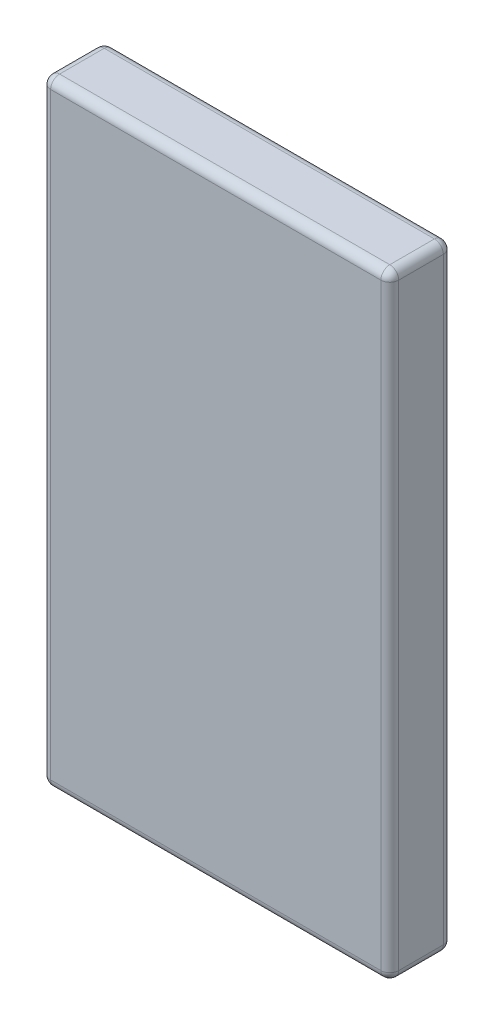
ISO-10303-21;
HEADER;
FILE_DESCRIPTION(('STEP AP214'),'2;1');
FILE_NAME('part.step','',(''),(''),'','','');
FILE_SCHEMA(('AUTOMOTIVE_DESIGN { 1 0 10303 214 1 1 1 1 }'));
ENDSEC;
DATA;
#1=APPLICATION_CONTEXT('core data for automotive mechanical design processes');
#2=APPLICATION_PROTOCOL_DEFINITION('international standard','automotive_design',2000,#1);
#3=PRODUCT_CONTEXT('',#1,'mechanical');
#4=PRODUCT('Part','Part','',(#3));
#5=PRODUCT_RELATED_PRODUCT_CATEGORY('part','',(#4));
#6=PRODUCT_DEFINITION_FORMATION('','',#4);
#7=PRODUCT_DEFINITION_CONTEXT('part definition',#1,'design');
#8=PRODUCT_DEFINITION('design','',#6,#7);
#9=PRODUCT_DEFINITION_SHAPE('','',#8);
#10=(LENGTH_UNIT() NAMED_UNIT(*) SI_UNIT(.MILLI.,.METRE.));
#11=(NAMED_UNIT(*) PLANE_ANGLE_UNIT() SI_UNIT($,.RADIAN.));
#12=(NAMED_UNIT(*) SI_UNIT($,.STERADIAN.) SOLID_ANGLE_UNIT());
#13=UNCERTAINTY_MEASURE_WITH_UNIT(LENGTH_MEASURE(1.E-05),#10,'distance_accuracy_value','');
#14=(GEOMETRIC_REPRESENTATION_CONTEXT(3) GLOBAL_UNCERTAINTY_ASSIGNED_CONTEXT((#13)) GLOBAL_UNIT_ASSIGNED_CONTEXT((#10,
#11,#12)) REPRESENTATION_CONTEXT('',''));
#15=CARTESIAN_POINT('',(0.,0.,0.));
#16=DIRECTION('',(0.,0.,1.));
#17=DIRECTION('',(1.,0.,0.));
#18=AXIS2_PLACEMENT_3D('',#15,#16,#17);
#19=CARTESIAN_POINT('',(-16.3760524459597,55.7720574898184,7.));
#20=DIRECTION('',(1.,0.,0.));
#21=DIRECTION('',(0.,1.,0.));
#22=AXIS2_PLACEMENT_3D('',#19,#20,#21);
#23=PLANE('',#22);
#24=DIRECTION('',(0.,0.,-1.));
#25=VECTOR('',#24,1.);
#26=CARTESIAN_POINT('',(-16.3760524459597,54.7720574898184,7.));
#27=LINE('',#26,#25);
#28=CARTESIAN_POINT('',(-16.3760524459597,54.7720574898184,6.));
#29=VERTEX_POINT('',#28);
#30=CARTESIAN_POINT('',(-16.3760524459597,54.7720574898184,1.));
#31=VERTEX_POINT('',#30);
#32=EDGE_CURVE('E136',#29,#31,#27,.T.);
#33=ORIENTED_EDGE('',*,*,#32,.T.);
#34=DIRECTION('',(0.,-1.,0.));
#35=VECTOR('',#34,1.);
#36=CARTESIAN_POINT('',(-16.3760524459597,55.7720574898184,1.));
#37=LINE('',#36,#35);
#38=CARTESIAN_POINT('',(-16.3760524459597,-12.2279425101816,1.));
#39=VERTEX_POINT('',#38);
#40=EDGE_CURVE('E132',#31,#39,#37,.T.);
#41=ORIENTED_EDGE('',*,*,#40,.T.);
#42=DIRECTION('',(0.,0.,-1.));
#43=VECTOR('',#42,1.);
#44=CARTESIAN_POINT('',(-16.3760524459597,-12.2279425101816,7.));
#45=LINE('',#44,#43);
#46=CARTESIAN_POINT('',(-16.3760524459597,-12.2279425101816,6.));
#47=VERTEX_POINT('',#46);
#48=EDGE_CURVE('E127',#39,#47,#45,.F.);
#49=ORIENTED_EDGE('',*,*,#48,.T.);
#50=DIRECTION('',(0.,-1.,0.));
#51=VECTOR('',#50,1.);
#52=CARTESIAN_POINT('',(-16.3760524459597,55.7720574898184,6.));
#53=LINE('',#52,#51);
#54=EDGE_CURVE('E129',#47,#29,#53,.F.);
#55=ORIENTED_EDGE('',*,*,#54,.T.);
#56=EDGE_LOOP('',(#33,#41,#49,#55));
#57=FACE_BOUND('',#56,.T.);
#58=ADVANCED_FACE('F35',(#57),#23,.F.);
#59=CARTESIAN_POINT('',(-16.3760524459597,-13.2279425101816,7.));
#60=DIRECTION('',(0.,1.,0.));
#61=DIRECTION('',(0.,0.,1.));
#62=AXIS2_PLACEMENT_3D('',#59,#60,#61);
#63=PLANE('',#62);
#64=DIRECTION('',(1.,0.,0.));
#65=VECTOR('',#64,1.);
#66=CARTESIAN_POINT('',(-16.3760524459597,-13.2279425101816,1.));
#67=LINE('',#66,#65);
#68=CARTESIAN_POINT('',(-15.3760524459597,-13.2279425101816,1.));
#69=VERTEX_POINT('',#68);
#70=CARTESIAN_POINT('',(21.6239475540403,-13.2279425101816,1.));
#71=VERTEX_POINT('',#70);
#72=EDGE_CURVE('E276',#69,#71,#67,.T.);
#73=ORIENTED_EDGE('',*,*,#72,.T.);
#74=DIRECTION('',(0.,0.,-1.));
#75=VECTOR('',#74,1.);
#76=CARTESIAN_POINT('',(21.6239475540403,-13.2279425101816,7.));
#77=LINE('',#76,#75);
#78=CARTESIAN_POINT('',(21.6239475540403,-13.2279425101816,6.));
#79=VERTEX_POINT('',#78);
#80=EDGE_CURVE('E279',#71,#79,#77,.F.);
#81=ORIENTED_EDGE('',*,*,#80,.T.);
#82=DIRECTION('',(1.,0.,0.));
#83=VECTOR('',#82,1.);
#84=CARTESIAN_POINT('',(-16.3760524459597,-13.2279425101816,6.));
#85=LINE('',#84,#83);
#86=CARTESIAN_POINT('',(-15.3760524459597,-13.2279425101816,6.));
#87=VERTEX_POINT('',#86);
#88=EDGE_CURVE('E270',#79,#87,#85,.F.);
#89=ORIENTED_EDGE('',*,*,#88,.T.);
#90=DIRECTION('',(0.,0.,-1.));
#91=VECTOR('',#90,1.);
#92=CARTESIAN_POINT('',(-15.3760524459597,-13.2279425101816,7.));
#93=LINE('',#92,#91);
#94=EDGE_CURVE('E158',#87,#69,#93,.T.);
#95=ORIENTED_EDGE('',*,*,#94,.T.);
#96=EDGE_LOOP('',(#73,#81,#89,#95));
#97=FACE_BOUND('',#96,.T.);
#98=ADVANCED_FACE('F325',(#97),#63,.F.);
#99=CARTESIAN_POINT('',(22.6239475540403,55.7720574898184,7.));
#100=DIRECTION('',(-1.,0.,0.));
#101=DIRECTION('',(0.,-1.,0.));
#102=AXIS2_PLACEMENT_3D('',#99,#100,#101);
#103=PLANE('',#102);
#104=DIRECTION('',(0.,1.,0.));
#105=VECTOR('',#104,1.);
#106=CARTESIAN_POINT('',(22.6239475540403,55.7720574898184,1.));
#107=LINE('',#106,#105);
#108=CARTESIAN_POINT('',(22.6239475540403,-12.2279425101816,1.));
#109=VERTEX_POINT('',#108);
#110=CARTESIAN_POINT('',(22.6239475540403,54.7720574898184,1.));
#111=VERTEX_POINT('',#110);
#112=EDGE_CURVE('E285',#109,#111,#107,.T.);
#113=ORIENTED_EDGE('',*,*,#112,.T.);
#114=DIRECTION('',(0.,0.,-1.));
#115=VECTOR('',#114,1.);
#116=CARTESIAN_POINT('',(22.6239475540403,54.7720574898184,7.));
#117=LINE('',#116,#115);
#118=CARTESIAN_POINT('',(22.6239475540403,54.7720574898184,6.));
#119=VERTEX_POINT('',#118);
#120=EDGE_CURVE('E213',#111,#119,#117,.F.);
#121=ORIENTED_EDGE('',*,*,#120,.T.);
#122=DIRECTION('',(0.,1.,0.));
#123=VECTOR('',#122,1.);
#124=CARTESIAN_POINT('',(22.6239475540403,-13.2279425101816,6.));
#125=LINE('',#124,#123);
#126=CARTESIAN_POINT('',(22.6239475540403,-12.2279425101816,6.));
#127=VERTEX_POINT('',#126);
#128=EDGE_CURVE('E283',#119,#127,#125,.F.);
#129=ORIENTED_EDGE('',*,*,#128,.T.);
#130=DIRECTION('',(0.,0.,-1.));
#131=VECTOR('',#130,1.);
#132=CARTESIAN_POINT('',(22.6239475540403,-12.2279425101816,7.));
#133=LINE('',#132,#131);
#134=EDGE_CURVE('E281',#127,#109,#133,.T.);
#135=ORIENTED_EDGE('',*,*,#134,.T.);
#136=EDGE_LOOP('',(#113,#121,#129,#135));
#137=FACE_BOUND('',#136,.T.);
#138=ADVANCED_FACE('F287',(#137),#103,.F.);
#139=CARTESIAN_POINT('',(-16.3760524459597,55.7720574898184,7.));
#140=DIRECTION('',(0.,-1.,0.));
#141=DIRECTION('',(0.,0.,-1.));
#142=AXIS2_PLACEMENT_3D('',#139,#140,#141);
#143=PLANE('',#142);
#144=DIRECTION('',(0.,0.,-1.));
#145=VECTOR('',#144,1.);
#146=CARTESIAN_POINT('',(21.6239475540403,55.7720574898184,7.));
#147=LINE('',#146,#145);
#148=CARTESIAN_POINT('',(21.6239475540403,55.7720574898184,6.));
#149=VERTEX_POINT('',#148);
#150=CARTESIAN_POINT('',(21.6239475540403,55.7720574898184,1.));
#151=VERTEX_POINT('',#150);
#152=EDGE_CURVE('E215',#149,#151,#147,.T.);
#153=ORIENTED_EDGE('',*,*,#152,.T.);
#154=DIRECTION('',(-1.,0.,0.));
#155=VECTOR('',#154,1.);
#156=CARTESIAN_POINT('',(-16.3760524459597,55.7720574898184,1.));
#157=LINE('',#156,#155);
#158=CARTESIAN_POINT('',(-15.3760524459597,55.7720574898184,1.));
#159=VERTEX_POINT('',#158);
#160=EDGE_CURVE('E222',#151,#159,#157,.T.);
#161=ORIENTED_EDGE('',*,*,#160,.T.);
#162=DIRECTION('',(0.,0.,-1.));
#163=VECTOR('',#162,1.);
#164=CARTESIAN_POINT('',(-15.3760524459597,55.7720574898184,7.));
#165=LINE('',#164,#163);
#166=CARTESIAN_POINT('',(-15.3760524459597,55.7720574898184,6.));
#167=VERTEX_POINT('',#166);
#168=EDGE_CURVE('E219',#159,#167,#165,.F.);
#169=ORIENTED_EDGE('',*,*,#168,.T.);
#170=DIRECTION('',(-1.,0.,0.));
#171=VECTOR('',#170,1.);
#172=CARTESIAN_POINT('',(22.6239475540403,55.7720574898184,6.));
#173=LINE('',#172,#171);
#174=EDGE_CURVE('E220',#167,#149,#173,.F.);
#175=ORIENTED_EDGE('',*,*,#174,.T.);
#176=EDGE_LOOP('',(#153,#161,#169,#175));
#177=FACE_BOUND('',#176,.T.);
#178=ADVANCED_FACE('F302',(#177),#143,.F.);
#179=CARTESIAN_POINT('',(0.,0.,7.));
#180=DIRECTION('',(0.,0.,1.));
#181=DIRECTION('',(1.,0.,0.));
#182=AXIS2_PLACEMENT_3D('',#179,#180,#181);
#183=PLANE('',#182);
#184=DIRECTION('',(0.,-1.,0.));
#185=VECTOR('',#184,1.);
#186=CARTESIAN_POINT('',(-15.3760524459597,-13.2279425101816,7.));
#187=LINE('',#186,#185);
#188=CARTESIAN_POINT('',(-15.3760524459597,54.7720574898184,7.));
#189=VERTEX_POINT('',#188);
#190=CARTESIAN_POINT('',(-15.3760524459597,-12.2279425101816,7.));
#191=VERTEX_POINT('',#190);
#192=EDGE_CURVE('E228',#189,#191,#187,.T.);
#193=ORIENTED_EDGE('',*,*,#192,.T.);
#194=DIRECTION('',(1.,0.,0.));
#195=VECTOR('',#194,1.);
#196=CARTESIAN_POINT('',(22.6239475540403,-12.2279425101816,7.));
#197=LINE('',#196,#195);
#198=CARTESIAN_POINT('',(21.6239475540403,-12.2279425101816,7.));
#199=VERTEX_POINT('',#198);
#200=EDGE_CURVE('E11',#191,#199,#197,.T.);
#201=ORIENTED_EDGE('',*,*,#200,.T.);
#202=DIRECTION('',(0.,1.,0.));
#203=VECTOR('',#202,1.);
#204=CARTESIAN_POINT('',(21.6239475540403,55.7720574898184,7.));
#205=LINE('',#204,#203);
#206=CARTESIAN_POINT('',(21.6239475540403,54.7720574898184,7.));
#207=VERTEX_POINT('',#206);
#208=EDGE_CURVE('E44',#199,#207,#205,.T.);
#209=ORIENTED_EDGE('',*,*,#208,.T.);
#210=DIRECTION('',(-1.,0.,0.));
#211=VECTOR('',#210,1.);
#212=CARTESIAN_POINT('',(-16.3760524459597,54.7720574898184,7.));
#213=LINE('',#212,#211);
#214=EDGE_CURVE('E230',#207,#189,#213,.T.);
#215=ORIENTED_EDGE('',*,*,#214,.T.);
#216=EDGE_LOOP('',(#193,#201,#209,#215));
#217=FACE_BOUND('',#216,.T.);
#218=ADVANCED_FACE('F350',(#217),#183,.T.);
#219=CARTESIAN_POINT('',(0.,0.,0.));
#220=DIRECTION('',(0.,0.,1.));
#221=DIRECTION('',(1.,0.,0.));
#222=AXIS2_PLACEMENT_3D('',#219,#220,#221);
#223=PLANE('',#222);
#224=DIRECTION('',(1.,0.,0.));
#225=VECTOR('',#224,1.);
#226=CARTESIAN_POINT('',(0.,-12.2279425101816,0.));
#227=LINE('',#226,#225);
#228=CARTESIAN_POINT('',(21.6239475540403,-12.2279425101816,0.));
#229=VERTEX_POINT('',#228);
#230=CARTESIAN_POINT('',(-15.3760524459597,-12.2279425101816,0.));
#231=VERTEX_POINT('',#230);
#232=EDGE_CURVE('E265',#229,#231,#227,.F.);
#233=ORIENTED_EDGE('',*,*,#232,.T.);
#234=DIRECTION('',(0.,-1.,0.));
#235=VECTOR('',#234,1.);
#236=CARTESIAN_POINT('',(-15.3760524459597,0.,0.));
#237=LINE('',#236,#235);
#238=CARTESIAN_POINT('',(-15.3760524459597,54.7720574898184,0.));
#239=VERTEX_POINT('',#238);
#240=EDGE_CURVE('E262',#231,#239,#237,.F.);
#241=ORIENTED_EDGE('',*,*,#240,.T.);
#242=DIRECTION('',(-1.,0.,0.));
#243=VECTOR('',#242,1.);
#244=CARTESIAN_POINT('',(0.,54.7720574898184,0.));
#245=LINE('',#244,#243);
#246=CARTESIAN_POINT('',(21.6239475540403,54.7720574898184,0.));
#247=VERTEX_POINT('',#246);
#248=EDGE_CURVE('E254',#239,#247,#245,.F.);
#249=ORIENTED_EDGE('',*,*,#248,.T.);
#250=DIRECTION('',(0.,1.,0.));
#251=VECTOR('',#250,1.);
#252=CARTESIAN_POINT('',(21.6239475540403,0.,0.));
#253=LINE('',#252,#251);
#254=EDGE_CURVE('E259',#247,#229,#253,.F.);
#255=ORIENTED_EDGE('',*,*,#254,.T.);
#256=EDGE_LOOP('',(#233,#241,#249,#255));
#257=FACE_BOUND('',#256,.T.);
#258=ADVANCED_FACE('F263',(#257),#223,.F.);
#259=CARTESIAN_POINT('',(21.6239475540403,0.,6.));
#260=DIRECTION('',(0.,-1.,0.));
#261=DIRECTION('',(1.,0.,0.));
#262=AXIS2_PLACEMENT_3D('',#259,#260,#261);
#263=CYLINDRICAL_SURFACE('',#262,1.);
#264=CARTESIAN_POINT('',(21.6239475540403,54.7720574898184,6.));
#265=DIRECTION('',(0.,1.,0.));
#266=DIRECTION('',(0.,0.,1.));
#267=AXIS2_PLACEMENT_3D('',#264,#265,#266);
#268=CIRCLE('',#267,1.);
#269=EDGE_CURVE('E39',#207,#119,#268,.T.);
#270=ORIENTED_EDGE('',*,*,#269,.F.);
#271=ORIENTED_EDGE('',*,*,#208,.F.);
#272=CARTESIAN_POINT('',(21.6239475540403,-12.2279425101816,6.));
#273=DIRECTION('',(0.,-1.,0.));
#274=DIRECTION('',(0.,0.,-1.));
#275=AXIS2_PLACEMENT_3D('',#272,#273,#274);
#276=CIRCLE('',#275,1.);
#277=EDGE_CURVE('E196',#127,#199,#276,.T.);
#278=ORIENTED_EDGE('',*,*,#277,.F.);
#279=ORIENTED_EDGE('',*,*,#128,.F.);
#280=EDGE_LOOP('',(#270,#271,#278,#279));
#281=FACE_BOUND('',#280,.T.);
#282=ADVANCED_FACE('F37',(#281),#263,.T.);
#283=CARTESIAN_POINT('',(21.6239475540403,54.7720574898184,6.));
#284=DIRECTION('',(0.,0.,1.));
#285=DIRECTION('',(1.,0.,0.));
#286=AXIS2_PLACEMENT_3D('',#283,#284,#285);
#287=SPHERICAL_SURFACE('',#286,1.);
#288=CARTESIAN_POINT('',(21.6239475540403,54.7720574898184,6.));
#289=DIRECTION('',(1.,0.,0.));
#290=DIRECTION('',(0.,0.,-1.));
#291=AXIS2_PLACEMENT_3D('',#288,#289,#290);
#292=CIRCLE('',#291,1.);
#293=EDGE_CURVE('E191',#207,#149,#292,.F.);
#294=ORIENTED_EDGE('',*,*,#293,.F.);
#295=ORIENTED_EDGE('',*,*,#269,.T.);
#296=CARTESIAN_POINT('',(21.6239475540403,54.7720574898184,6.));
#297=DIRECTION('',(0.,0.,1.));
#298=DIRECTION('',(1.,0.,0.));
#299=AXIS2_PLACEMENT_3D('',#296,#297,#298);
#300=CIRCLE('',#299,1.);
#301=EDGE_CURVE('E194',#149,#119,#300,.F.);
#302=ORIENTED_EDGE('',*,*,#301,.F.);
#303=EDGE_LOOP('',(#294,#295,#302));
#304=FACE_BOUND('',#303,.T.);
#305=ADVANCED_FACE('F204',(#304),#287,.T.);
#306=CARTESIAN_POINT('',(21.6239475540403,-12.2279425101816,6.));
#307=DIRECTION('',(0.,0.,1.));
#308=DIRECTION('',(1.,0.,0.));
#309=AXIS2_PLACEMENT_3D('',#306,#307,#308);
#310=SPHERICAL_SURFACE('',#309,1.);
#311=CARTESIAN_POINT('',(21.6239475540403,-12.2279425101816,6.));
#312=DIRECTION('',(0.,0.,1.));
#313=DIRECTION('',(1.,0.,0.));
#314=AXIS2_PLACEMENT_3D('',#311,#312,#313);
#315=CIRCLE('',#314,1.);
#316=EDGE_CURVE('E187',#127,#79,#315,.F.);
#317=ORIENTED_EDGE('',*,*,#316,.F.);
#318=ORIENTED_EDGE('',*,*,#277,.T.);
#319=CARTESIAN_POINT('',(21.6239475540403,-12.2279425101816,6.));
#320=DIRECTION('',(1.,0.,0.));
#321=DIRECTION('',(0.,0.,-1.));
#322=AXIS2_PLACEMENT_3D('',#319,#320,#321);
#323=CIRCLE('',#322,1.);
#324=EDGE_CURVE('E52',#79,#199,#323,.F.);
#325=ORIENTED_EDGE('',*,*,#324,.F.);
#326=EDGE_LOOP('',(#317,#318,#325));
#327=FACE_BOUND('',#326,.T.);
#328=ADVANCED_FACE('F290',(#327),#310,.T.);
#329=CARTESIAN_POINT('',(21.6239475540403,54.7720574898184,7.));
#330=DIRECTION('',(0.,0.,-1.));
#331=DIRECTION('',(-1.,0.,0.));
#332=AXIS2_PLACEMENT_3D('',#329,#330,#331);
#333=CYLINDRICAL_SURFACE('',#332,1.);
#334=ORIENTED_EDGE('',*,*,#301,.T.);
#335=ORIENTED_EDGE('',*,*,#120,.F.);
#336=CARTESIAN_POINT('',(21.6239475540403,54.7720574898184,1.));
#337=DIRECTION('',(0.,0.,-1.));
#338=DIRECTION('',(-1.,0.,0.));
#339=AXIS2_PLACEMENT_3D('',#336,#337,#338);
#340=CIRCLE('',#339,1.);
#341=EDGE_CURVE('E182',#151,#111,#340,.T.);
#342=ORIENTED_EDGE('',*,*,#341,.F.);
#343=ORIENTED_EDGE('',*,*,#152,.F.);
#344=EDGE_LOOP('',(#334,#335,#342,#343));
#345=FACE_BOUND('',#344,.T.);
#346=ADVANCED_FACE('F211',(#345),#333,.T.);
#347=CARTESIAN_POINT('',(0.,54.7720574898184,6.));
#348=DIRECTION('',(1.,0.,0.));
#349=DIRECTION('',(0.,0.,-1.));
#350=AXIS2_PLACEMENT_3D('',#347,#348,#349);
#351=CYLINDRICAL_SURFACE('',#350,1.);
#352=ORIENTED_EDGE('',*,*,#293,.T.);
#353=ORIENTED_EDGE('',*,*,#174,.F.);
#354=CARTESIAN_POINT('',(-15.3760524459597,54.7720574898184,6.));
#355=DIRECTION('',(-1.,0.,0.));
#356=DIRECTION('',(0.,0.,1.));
#357=AXIS2_PLACEMENT_3D('',#354,#355,#356);
#358=CIRCLE('',#357,1.);
#359=EDGE_CURVE('E179',#189,#167,#358,.T.);
#360=ORIENTED_EDGE('',*,*,#359,.F.);
#361=ORIENTED_EDGE('',*,*,#214,.F.);
#362=EDGE_LOOP('',(#352,#353,#360,#361));
#363=FACE_BOUND('',#362,.T.);
#364=ADVANCED_FACE('F307',(#363),#351,.T.);
#365=CARTESIAN_POINT('',(-15.3760524459597,0.,6.));
#366=DIRECTION('',(0.,1.,0.));
#367=DIRECTION('',(-1.,0.,0.));
#368=AXIS2_PLACEMENT_3D('',#365,#366,#367);
#369=CYLINDRICAL_SURFACE('',#368,1.);
#370=CARTESIAN_POINT('',(-15.3760524459597,-12.2279425101816,6.));
#371=DIRECTION('',(0.,-1.,0.));
#372=DIRECTION('',(0.,0.,-1.));
#373=AXIS2_PLACEMENT_3D('',#370,#371,#372);
#374=CIRCLE('',#373,1.);
#375=EDGE_CURVE('E143',#191,#47,#374,.T.);
#376=ORIENTED_EDGE('',*,*,#375,.F.);
#377=ORIENTED_EDGE('',*,*,#192,.F.);
#378=CARTESIAN_POINT('',(-15.3760524459597,54.7720574898184,6.));
#379=DIRECTION('',(0.,1.,0.));
#380=DIRECTION('',(0.,0.,1.));
#381=AXIS2_PLACEMENT_3D('',#378,#379,#380);
#382=CIRCLE('',#381,1.);
#383=EDGE_CURVE('E146',#29,#189,#382,.T.);
#384=ORIENTED_EDGE('',*,*,#383,.F.);
#385=ORIENTED_EDGE('',*,*,#54,.F.);
#386=EDGE_LOOP('',(#376,#377,#384,#385));
#387=FACE_BOUND('',#386,.T.);
#388=ADVANCED_FACE('F141',(#387),#369,.T.);
#389=CARTESIAN_POINT('',(0.,-12.2279425101816,6.));
#390=DIRECTION('',(-1.,0.,0.));
#391=DIRECTION('',(0.,0.,1.));
#392=AXIS2_PLACEMENT_3D('',#389,#390,#391);
#393=CYLINDRICAL_SURFACE('',#392,1.);
#394=ORIENTED_EDGE('',*,*,#324,.T.);
#395=ORIENTED_EDGE('',*,*,#200,.F.);
#396=CARTESIAN_POINT('',(-15.3760524459597,-12.2279425101816,6.));
#397=DIRECTION('',(-1.,0.,0.));
#398=DIRECTION('',(0.,0.,1.));
#399=AXIS2_PLACEMENT_3D('',#396,#397,#398);
#400=CIRCLE('',#399,1.);
#401=EDGE_CURVE('E155',#87,#191,#400,.T.);
#402=ORIENTED_EDGE('',*,*,#401,.F.);
#403=ORIENTED_EDGE('',*,*,#88,.F.);
#404=EDGE_LOOP('',(#394,#395,#402,#403));
#405=FACE_BOUND('',#404,.T.);
#406=ADVANCED_FACE('F349',(#405),#393,.T.);
#407=CARTESIAN_POINT('',(21.6239475540403,-12.2279425101816,7.));
#408=DIRECTION('',(0.,0.,-1.));
#409=DIRECTION('',(-1.,0.,0.));
#410=AXIS2_PLACEMENT_3D('',#407,#408,#409);
#411=CYLINDRICAL_SURFACE('',#410,1.);
#412=ORIENTED_EDGE('',*,*,#316,.T.);
#413=ORIENTED_EDGE('',*,*,#80,.F.);
#414=CARTESIAN_POINT('',(21.6239475540403,-12.2279425101816,1.));
#415=DIRECTION('',(0.,0.,-1.));
#416=DIRECTION('',(-1.,0.,0.));
#417=AXIS2_PLACEMENT_3D('',#414,#415,#416);
#418=CIRCLE('',#417,1.);
#419=EDGE_CURVE('E174',#109,#71,#418,.T.);
#420=ORIENTED_EDGE('',*,*,#419,.F.);
#421=ORIENTED_EDGE('',*,*,#134,.F.);
#422=EDGE_LOOP('',(#412,#413,#420,#421));
#423=FACE_BOUND('',#422,.T.);
#424=ADVANCED_FACE('F294',(#423),#411,.T.);
#425=CARTESIAN_POINT('',(21.6239475540403,55.7720574898184,1.));
#426=DIRECTION('',(0.,1.,0.));
#427=DIRECTION('',(-1.,0.,0.));
#428=AXIS2_PLACEMENT_3D('',#425,#426,#427);
#429=CYLINDRICAL_SURFACE('',#428,1.);
#430=CARTESIAN_POINT('',(21.6239475540403,54.7720574898184,1.));
#431=DIRECTION('',(0.,1.,0.));
#432=DIRECTION('',(0.,0.,1.));
#433=AXIS2_PLACEMENT_3D('',#430,#431,#432);
#434=CIRCLE('',#433,1.);
#435=EDGE_CURVE('E184',#111,#247,#434,.T.);
#436=ORIENTED_EDGE('',*,*,#435,.F.);
#437=ORIENTED_EDGE('',*,*,#112,.F.);
#438=CARTESIAN_POINT('',(21.6239475540403,-12.2279425101816,1.));
#439=DIRECTION('',(0.,-1.,0.));
#440=DIRECTION('',(0.,0.,-1.));
#441=AXIS2_PLACEMENT_3D('',#438,#439,#440);
#442=CIRCLE('',#441,1.);
#443=EDGE_CURVE('E171',#229,#109,#442,.T.);
#444=ORIENTED_EDGE('',*,*,#443,.F.);
#445=ORIENTED_EDGE('',*,*,#254,.F.);
#446=EDGE_LOOP('',(#436,#437,#444,#445));
#447=FACE_BOUND('',#446,.T.);
#448=ADVANCED_FACE('F298',(#447),#429,.T.);
#449=CARTESIAN_POINT('',(21.6239475540403,54.7720574898184,1.));
#450=DIRECTION('',(0.,0.,1.));
#451=DIRECTION('',(1.,0.,0.));
#452=AXIS2_PLACEMENT_3D('',#449,#450,#451);
#453=SPHERICAL_SURFACE('',#452,1.);
#454=ORIENTED_EDGE('',*,*,#341,.T.);
#455=ORIENTED_EDGE('',*,*,#435,.T.);
#456=CARTESIAN_POINT('',(21.6239475540403,54.7720574898184,1.));
#457=DIRECTION('',(1.,0.,0.));
#458=DIRECTION('',(0.,0.,-1.));
#459=AXIS2_PLACEMENT_3D('',#456,#457,#458);
#460=CIRCLE('',#459,1.);
#461=EDGE_CURVE('E163',#151,#247,#460,.F.);
#462=ORIENTED_EDGE('',*,*,#461,.F.);
#463=EDGE_LOOP('',(#454,#455,#462));
#464=FACE_BOUND('',#463,.T.);
#465=ADVANCED_FACE('F301',(#464),#453,.T.);
#466=CARTESIAN_POINT('',(-15.3760524459597,54.7720574898184,6.));
#467=DIRECTION('',(0.,0.,1.));
#468=DIRECTION('',(1.,0.,0.));
#469=AXIS2_PLACEMENT_3D('',#466,#467,#468);
#470=SPHERICAL_SURFACE('',#469,1.);
#471=ORIENTED_EDGE('',*,*,#383,.T.);
#472=ORIENTED_EDGE('',*,*,#359,.T.);
#473=CARTESIAN_POINT('',(-15.3760524459597,54.7720574898184,6.));
#474=DIRECTION('',(0.,0.,1.));
#475=DIRECTION('',(1.,0.,0.));
#476=AXIS2_PLACEMENT_3D('',#473,#474,#475);
#477=CIRCLE('',#476,1.);
#478=EDGE_CURVE('E159',#29,#167,#477,.F.);
#479=ORIENTED_EDGE('',*,*,#478,.F.);
#480=EDGE_LOOP('',(#471,#472,#479));
#481=FACE_BOUND('',#480,.T.);
#482=ADVANCED_FACE('F309',(#481),#470,.T.);
#483=CARTESIAN_POINT('',(-15.3760524459597,-12.2279425101816,6.));
#484=DIRECTION('',(0.,0.,1.));
#485=DIRECTION('',(1.,0.,0.));
#486=AXIS2_PLACEMENT_3D('',#483,#484,#485);
#487=SPHERICAL_SURFACE('',#486,1.);
#488=ORIENTED_EDGE('',*,*,#401,.T.);
#489=ORIENTED_EDGE('',*,*,#375,.T.);
#490=CARTESIAN_POINT('',(-15.3760524459597,-12.2279425101816,6.));
#491=DIRECTION('',(0.,0.,1.));
#492=DIRECTION('',(1.,0.,0.));
#493=AXIS2_PLACEMENT_3D('',#490,#491,#492);
#494=CIRCLE('',#493,1.);
#495=EDGE_CURVE('E152',#87,#47,#494,.F.);
#496=ORIENTED_EDGE('',*,*,#495,.F.);
#497=EDGE_LOOP('',(#488,#489,#496));
#498=FACE_BOUND('',#497,.T.);
#499=ADVANCED_FACE('F151',(#498),#487,.T.);
#500=CARTESIAN_POINT('',(21.6239475540403,-12.2279425101816,1.));
#501=DIRECTION('',(0.,0.,1.));
#502=DIRECTION('',(1.,0.,0.));
#503=AXIS2_PLACEMENT_3D('',#500,#501,#502);
#504=SPHERICAL_SURFACE('',#503,1.);
#505=ORIENTED_EDGE('',*,*,#443,.T.);
#506=ORIENTED_EDGE('',*,*,#419,.T.);
#507=CARTESIAN_POINT('',(21.6239475540403,-12.2279425101816,1.));
#508=DIRECTION('',(1.,0.,0.));
#509=DIRECTION('',(0.,0.,-1.));
#510=AXIS2_PLACEMENT_3D('',#507,#508,#509);
#511=CIRCLE('',#510,1.);
#512=EDGE_CURVE('E160',#229,#71,#511,.F.);
#513=ORIENTED_EDGE('',*,*,#512,.F.);
#514=EDGE_LOOP('',(#505,#506,#513));
#515=FACE_BOUND('',#514,.T.);
#516=ADVANCED_FACE('F322',(#515),#504,.T.);
#517=CARTESIAN_POINT('',(-16.3760524459597,54.7720574898184,1.));
#518=DIRECTION('',(-1.,0.,0.));
#519=DIRECTION('',(0.,0.,1.));
#520=AXIS2_PLACEMENT_3D('',#517,#518,#519);
#521=CYLINDRICAL_SURFACE('',#520,1.);
#522=ORIENTED_EDGE('',*,*,#461,.T.);
#523=ORIENTED_EDGE('',*,*,#248,.F.);
#524=CARTESIAN_POINT('',(-15.3760524459597,54.7720574898184,1.));
#525=DIRECTION('',(-1.,0.,0.));
#526=DIRECTION('',(0.,0.,1.));
#527=AXIS2_PLACEMENT_3D('',#524,#525,#526);
#528=CIRCLE('',#527,1.);
#529=EDGE_CURVE('E165',#159,#239,#528,.T.);
#530=ORIENTED_EDGE('',*,*,#529,.F.);
#531=ORIENTED_EDGE('',*,*,#160,.F.);
#532=EDGE_LOOP('',(#522,#523,#530,#531));
#533=FACE_BOUND('',#532,.T.);
#534=ADVANCED_FACE('F256',(#533),#521,.T.);
#535=CARTESIAN_POINT('',(-15.3760524459597,54.7720574898184,7.));
#536=DIRECTION('',(0.,0.,-1.));
#537=DIRECTION('',(-1.,0.,0.));
#538=AXIS2_PLACEMENT_3D('',#535,#536,#537);
#539=CYLINDRICAL_SURFACE('',#538,1.);
#540=ORIENTED_EDGE('',*,*,#478,.T.);
#541=ORIENTED_EDGE('',*,*,#168,.F.);
#542=CARTESIAN_POINT('',(-15.3760524459597,54.7720574898184,1.));
#543=DIRECTION('',(0.,0.,-1.));
#544=DIRECTION('',(-1.,0.,0.));
#545=AXIS2_PLACEMENT_3D('',#542,#543,#544);
#546=CIRCLE('',#545,1.);
#547=EDGE_CURVE('E243',#31,#159,#546,.T.);
#548=ORIENTED_EDGE('',*,*,#547,.F.);
#549=ORIENTED_EDGE('',*,*,#32,.F.);
#550=EDGE_LOOP('',(#540,#541,#548,#549));
#551=FACE_BOUND('',#550,.T.);
#552=ADVANCED_FACE('F311',(#551),#539,.T.);
#553=CARTESIAN_POINT('',(-15.3760524459597,-12.2279425101816,7.));
#554=DIRECTION('',(0.,0.,-1.));
#555=DIRECTION('',(-1.,0.,0.));
#556=AXIS2_PLACEMENT_3D('',#553,#554,#555);
#557=CYLINDRICAL_SURFACE('',#556,1.);
#558=ORIENTED_EDGE('',*,*,#495,.T.);
#559=ORIENTED_EDGE('',*,*,#48,.F.);
#560=CARTESIAN_POINT('',(-15.3760524459597,-12.2279425101816,1.));
#561=DIRECTION('',(0.,0.,-1.));
#562=DIRECTION('',(-1.,0.,0.));
#563=AXIS2_PLACEMENT_3D('',#560,#561,#562);
#564=CIRCLE('',#563,1.);
#565=EDGE_CURVE('E240',#69,#39,#564,.T.);
#566=ORIENTED_EDGE('',*,*,#565,.F.);
#567=ORIENTED_EDGE('',*,*,#94,.F.);
#568=EDGE_LOOP('',(#558,#559,#566,#567));
#569=FACE_BOUND('',#568,.T.);
#570=ADVANCED_FACE('F157',(#569),#557,.T.);
#571=CARTESIAN_POINT('',(-16.3760524459597,-12.2279425101816,1.));
#572=DIRECTION('',(1.,0.,0.));
#573=DIRECTION('',(0.,0.,-1.));
#574=AXIS2_PLACEMENT_3D('',#571,#572,#573);
#575=CYLINDRICAL_SURFACE('',#574,1.);
#576=ORIENTED_EDGE('',*,*,#512,.T.);
#577=ORIENTED_EDGE('',*,*,#72,.F.);
#578=CARTESIAN_POINT('',(-15.3760524459597,-12.2279425101816,1.));
#579=DIRECTION('',(-1.,0.,0.));
#580=DIRECTION('',(0.,0.,1.));
#581=AXIS2_PLACEMENT_3D('',#578,#579,#580);
#582=CIRCLE('',#581,1.);
#583=EDGE_CURVE('E237',#231,#69,#582,.T.);
#584=ORIENTED_EDGE('',*,*,#583,.F.);
#585=ORIENTED_EDGE('',*,*,#232,.F.);
#586=EDGE_LOOP('',(#576,#577,#584,#585));
#587=FACE_BOUND('',#586,.T.);
#588=ADVANCED_FACE('F320',(#587),#575,.T.);
#589=CARTESIAN_POINT('',(-15.3760524459597,54.7720574898184,1.));
#590=DIRECTION('',(0.,0.,1.));
#591=DIRECTION('',(1.,0.,0.));
#592=AXIS2_PLACEMENT_3D('',#589,#590,#591);
#593=SPHERICAL_SURFACE('',#592,1.);
#594=ORIENTED_EDGE('',*,*,#547,.T.);
#595=ORIENTED_EDGE('',*,*,#529,.T.);
#596=CARTESIAN_POINT('',(-15.3760524459597,54.7720574898184,1.));
#597=DIRECTION('',(0.,1.,0.));
#598=DIRECTION('',(0.,0.,1.));
#599=AXIS2_PLACEMENT_3D('',#596,#597,#598);
#600=CIRCLE('',#599,1.);
#601=EDGE_CURVE('E235',#31,#239,#600,.F.);
#602=ORIENTED_EDGE('',*,*,#601,.F.);
#603=EDGE_LOOP('',(#594,#595,#602));
#604=FACE_BOUND('',#603,.T.);
#605=ADVANCED_FACE('F249',(#604),#593,.T.);
#606=CARTESIAN_POINT('',(-15.3760524459597,-12.2279425101816,1.));
#607=DIRECTION('',(0.,0.,1.));
#608=DIRECTION('',(1.,0.,0.));
#609=AXIS2_PLACEMENT_3D('',#606,#607,#608);
#610=SPHERICAL_SURFACE('',#609,1.);
#611=ORIENTED_EDGE('',*,*,#583,.T.);
#612=ORIENTED_EDGE('',*,*,#565,.T.);
#613=CARTESIAN_POINT('',(-15.3760524459597,-12.2279425101816,1.));
#614=DIRECTION('',(0.,-1.,0.));
#615=DIRECTION('',(0.,0.,-1.));
#616=AXIS2_PLACEMENT_3D('',#613,#614,#615);
#617=CIRCLE('',#616,1.);
#618=EDGE_CURVE('E233',#231,#39,#617,.F.);
#619=ORIENTED_EDGE('',*,*,#618,.F.);
#620=EDGE_LOOP('',(#611,#612,#619));
#621=FACE_BOUND('',#620,.T.);
#622=ADVANCED_FACE('F337',(#621),#610,.T.);
#623=CARTESIAN_POINT('',(-15.3760524459597,55.7720574898184,1.));
#624=DIRECTION('',(0.,-1.,0.));
#625=DIRECTION('',(1.,0.,0.));
#626=AXIS2_PLACEMENT_3D('',#623,#624,#625);
#627=CYLINDRICAL_SURFACE('',#626,1.);
#628=ORIENTED_EDGE('',*,*,#601,.T.);
#629=ORIENTED_EDGE('',*,*,#240,.F.);
#630=ORIENTED_EDGE('',*,*,#618,.T.);
#631=ORIENTED_EDGE('',*,*,#40,.F.);
#632=EDGE_LOOP('',(#628,#629,#630,#631));
#633=FACE_BOUND('',#632,.T.);
#634=ADVANCED_FACE('F334',(#633),#627,.T.);
#635=CLOSED_SHELL('',(#58,#98,#138,#178,#218,#258,#282,#305,#328,#346,#364,#388,#406,#424,#448,
#465,#482,#499,#516,#534,#552,#570,#588,#605,#622,#634));
#636=MANIFOLD_SOLID_BREP('B2',#635);
#637=ADVANCED_BREP_SHAPE_REPRESENTATION('',(#18,#636),#14);
#638=SHAPE_DEFINITION_REPRESENTATION(#9,#637);
ENDSEC;
END-ISO-10303-21;
